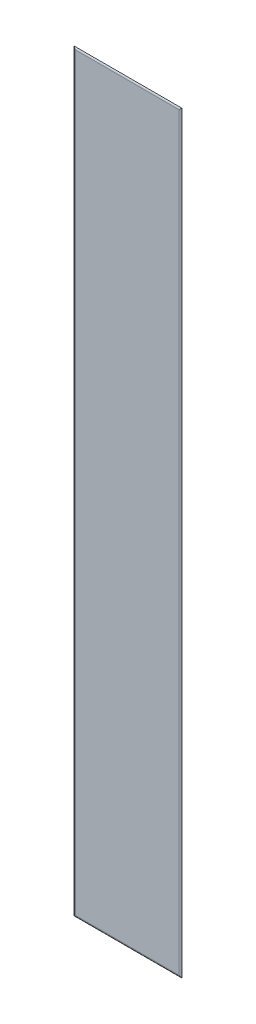
ISO-10303-21;
HEADER;
FILE_DESCRIPTION(('STEP AP214'),'2;1');
FILE_NAME('part.step','',(''),(''),'','','');
FILE_SCHEMA(('AUTOMOTIVE_DESIGN { 1 0 10303 214 1 1 1 1 }'));
ENDSEC;
DATA;
#1=APPLICATION_CONTEXT('core data for automotive mechanical design processes');
#2=APPLICATION_PROTOCOL_DEFINITION('international standard','automotive_design',2000,#1);
#3=PRODUCT_CONTEXT('',#1,'mechanical');
#4=PRODUCT('Part','Part','',(#3));
#5=PRODUCT_RELATED_PRODUCT_CATEGORY('part','',(#4));
#6=PRODUCT_DEFINITION_FORMATION('','',#4);
#7=PRODUCT_DEFINITION_CONTEXT('part definition',#1,'design');
#8=PRODUCT_DEFINITION('design','',#6,#7);
#9=PRODUCT_DEFINITION_SHAPE('','',#8);
#10=(LENGTH_UNIT() NAMED_UNIT(*) SI_UNIT(.MILLI.,.METRE.));
#11=(NAMED_UNIT(*) PLANE_ANGLE_UNIT() SI_UNIT($,.RADIAN.));
#12=(NAMED_UNIT(*) SI_UNIT($,.STERADIAN.) SOLID_ANGLE_UNIT());
#13=UNCERTAINTY_MEASURE_WITH_UNIT(LENGTH_MEASURE(1.E-05),#10,'distance_accuracy_value','');
#14=(GEOMETRIC_REPRESENTATION_CONTEXT(3) GLOBAL_UNCERTAINTY_ASSIGNED_CONTEXT((#13)) GLOBAL_UNIT_ASSIGNED_CONTEXT((#10,
#11,#12)) REPRESENTATION_CONTEXT('',''));
#15=CARTESIAN_POINT('',(0.,0.,0.));
#16=DIRECTION('',(0.,0.,1.));
#17=DIRECTION('',(1.,0.,0.));
#18=AXIS2_PLACEMENT_3D('',#15,#16,#17);
#19=CARTESIAN_POINT('',(-7.453921944202,4.992858571571,-0.007));
#20=DIRECTION('',(1.,0.,0.));
#21=DIRECTION('',(0.,0.71414284285414,0.700000000000148));
#22=AXIS2_PLACEMENT_3D('',#19,#20,#21);
#23=CYLINDRICAL_SURFACE('',#22,0.01);
#24=DIRECTION('',(1.,0.,0.));
#25=VECTOR('',#24,1.);
#26=CARTESIAN_POINT('',(-7.453921944202,4.992858571571,0.003));
#27=LINE('',#26,#25);
#28=CARTESIAN_POINT('',(-7.846780515773,4.992858571571,0.003));
#29=VERTEX_POINT('',#28);
#30=CARTESIAN_POINT('',(-7.46106337263,4.992858571571,0.003));
#31=VERTEX_POINT('',#30);
#32=EDGE_CURVE('E107',#29,#31,#27,.T.);
#33=ORIENTED_EDGE('',*,*,#32,.T.);
#34=CARTESIAN_POINT('',(-7.46106337263,4.992858571571,0.003));
#35=CARTESIAN_POINT('',(-7.45833966839473,4.99558227580627,0.00300000000000001));
#36=CARTESIAN_POINT('',(-7.45582853716617,4.99809340703483,0.00194511388568464));
#37=CARTESIAN_POINT('',(-7.453921944202,5.,0.));
#38=(BOUNDED_CURVE() B_SPLINE_CURVE(3,(#34,#35,#36,#37),.UNSPECIFIED.,.F.,
.F.) B_SPLINE_CURVE_WITH_KNOTS((4,4),(1.5707963267949,2.36619515697608),
.UNSPECIFIED.) CURVE() GEOMETRIC_REPRESENTATION_ITEM() RATIONAL_B_SPLINE_CURVE((1.,
0.947969630486574,0.947969630486574,1.)) REPRESENTATION_ITEM(''));
#39=CARTESIAN_POINT('',(-7.453921944202,5.,0.));
#40=VERTEX_POINT('',#39);
#41=EDGE_CURVE('E11',#31,#40,#38,.T.);
#42=ORIENTED_EDGE('',*,*,#41,.T.);
#43=DIRECTION('',(-1.,0.,0.));
#44=VECTOR('',#43,1.);
#45=CARTESIAN_POINT('',(-7.453921944202,5.,0.));
#46=LINE('',#45,#44);
#47=CARTESIAN_POINT('',(-7.853921944202,5.,0.));
#48=VERTEX_POINT('',#47);
#49=EDGE_CURVE('E95',#40,#48,#46,.T.);
#50=ORIENTED_EDGE('',*,*,#49,.T.);
#51=CARTESIAN_POINT('',(-7.846780515773,4.992858571571,0.003));
#52=CARTESIAN_POINT('',(-7.84950422000844,4.99558227580643,0.00300000000000001));
#53=CARTESIAN_POINT('',(-7.85201535123712,4.99809340703512,0.0019451138855627));
#54=CARTESIAN_POINT('',(-7.853921944202,5.,0.));
#55=(BOUNDED_CURVE() B_SPLINE_CURVE(3,(#51,#52,#53,#54),.UNSPECIFIED.,.F.,
.F.) B_SPLINE_CURVE_WITH_KNOTS((4,4),(1.5707963267949,2.36619515702201),
.UNSPECIFIED.) CURVE() GEOMETRIC_REPRESENTATION_ITEM() RATIONAL_B_SPLINE_CURVE((1.,
0.947969630480644,0.947969630480644,1.)) REPRESENTATION_ITEM(''));
#56=EDGE_CURVE('E20',#29,#48,#55,.T.);
#57=ORIENTED_EDGE('',*,*,#56,.F.);
#58=EDGE_LOOP('',(#33,#42,#50,#57));
#59=FACE_BOUND('',#58,.T.);
#60=ADVANCED_FACE('F16',(#59),#23,.T.);
#61=CARTESIAN_POINT('',(-7.46106337263,2.2,-0.007));
#62=DIRECTION('',(0.,-1.,0.));
#63=DIRECTION('',(0.71414284285414,0.,0.700000000000148));
#64=AXIS2_PLACEMENT_3D('',#61,#62,#63);
#65=CYLINDRICAL_SURFACE('',#64,0.01);
#66=DIRECTION('',(0.,-1.,0.));
#67=VECTOR('',#66,1.);
#68=CARTESIAN_POINT('',(-7.46106337263,2.2,0.003));
#69=LINE('',#68,#67);
#70=CARTESIAN_POINT('',(-7.46106337263,2.207141428429,0.003));
#71=VERTEX_POINT('',#70);
#72=EDGE_CURVE('E81',#31,#71,#69,.T.);
#73=ORIENTED_EDGE('',*,*,#72,.T.);
#74=CARTESIAN_POINT('',(-7.46106337263,2.207141428429,0.003));
#75=CARTESIAN_POINT('',(-7.45833966839473,2.20441772419373,0.00300000000000001));
#76=CARTESIAN_POINT('',(-7.45582853716617,2.20190659296517,0.00194511388568464));
#77=CARTESIAN_POINT('',(-7.453921944202,2.2,0.));
#78=(BOUNDED_CURVE() B_SPLINE_CURVE(3,(#74,#75,#76,#77),.UNSPECIFIED.,.F.,
.F.) B_SPLINE_CURVE_WITH_KNOTS((4,4),(1.5707963267949,2.36619515697608),
.UNSPECIFIED.) CURVE() GEOMETRIC_REPRESENTATION_ITEM() RATIONAL_B_SPLINE_CURVE((1.,
0.947969630486574,0.947969630486574,1.)) REPRESENTATION_ITEM(''));
#79=CARTESIAN_POINT('',(-7.453921944202,2.2,0.));
#80=VERTEX_POINT('',#79);
#81=EDGE_CURVE('E28',#71,#80,#78,.T.);
#82=ORIENTED_EDGE('',*,*,#81,.T.);
#83=DIRECTION('',(0.,1.,0.));
#84=VECTOR('',#83,1.);
#85=CARTESIAN_POINT('',(-7.453921944202,2.2,0.));
#86=LINE('',#85,#84);
#87=EDGE_CURVE('E79',#80,#40,#86,.T.);
#88=ORIENTED_EDGE('',*,*,#87,.T.);
#89=ORIENTED_EDGE('',*,*,#41,.F.);
#90=EDGE_LOOP('',(#73,#82,#88,#89));
#91=FACE_BOUND('',#90,.T.);
#92=ADVANCED_FACE('F77',(#91),#65,.T.);
#93=CARTESIAN_POINT('',(-7.853921944202,2.207141428429,-0.007));
#94=DIRECTION('',(-1.,0.,0.));
#95=DIRECTION('',(0.,-0.71414284285414,0.700000000000148));
#96=AXIS2_PLACEMENT_3D('',#93,#94,#95);
#97=CYLINDRICAL_SURFACE('',#96,0.01);
#98=DIRECTION('',(-1.,0.,0.));
#99=VECTOR('',#98,1.);
#100=CARTESIAN_POINT('',(-7.853921944202,2.207141428429,0.003));
#101=LINE('',#100,#99);
#102=CARTESIAN_POINT('',(-7.846780515773,2.207141428429,0.003));
#103=VERTEX_POINT('',#102);
#104=EDGE_CURVE('E128',#71,#103,#101,.T.);
#105=ORIENTED_EDGE('',*,*,#104,.T.);
#106=CARTESIAN_POINT('',(-7.846780515773,2.207141428429,0.003));
#107=CARTESIAN_POINT('',(-7.84950422000843,2.20441772419357,0.00300000000000005));
#108=CARTESIAN_POINT('',(-7.85201535123712,2.20190659296488,0.00194511388556276));
#109=CARTESIAN_POINT('',(-7.853921944202,2.2,0.));
#110=(BOUNDED_CURVE() B_SPLINE_CURVE(3,(#106,#107,#108,#109),.UNSPECIFIED.,.F.,
.F.) B_SPLINE_CURVE_WITH_KNOTS((4,4),(1.57079632679491,2.36619515702203),
.UNSPECIFIED.) CURVE() GEOMETRIC_REPRESENTATION_ITEM() RATIONAL_B_SPLINE_CURVE((1.,
0.947969630480644,0.947969630480644,1.)) REPRESENTATION_ITEM(''));
#111=CARTESIAN_POINT('',(-7.853921944202,2.2,0.));
#112=VERTEX_POINT('',#111);
#113=EDGE_CURVE('E52',#103,#112,#110,.T.);
#114=ORIENTED_EDGE('',*,*,#113,.T.);
#115=DIRECTION('',(1.,0.,0.));
#116=VECTOR('',#115,1.);
#117=CARTESIAN_POINT('',(-7.853921944202,2.2,0.));
#118=LINE('',#117,#116);
#119=EDGE_CURVE('E86',#112,#80,#118,.T.);
#120=ORIENTED_EDGE('',*,*,#119,.T.);
#121=ORIENTED_EDGE('',*,*,#81,.F.);
#122=EDGE_LOOP('',(#105,#114,#120,#121));
#123=FACE_BOUND('',#122,.T.);
#124=ADVANCED_FACE('F18',(#123),#97,.T.);
#125=CARTESIAN_POINT('',(-7.846780515773,5.,-0.007));
#126=DIRECTION('',(0.,1.,0.));
#127=DIRECTION('',(-0.71414284285414,0.,0.700000000000148));
#128=AXIS2_PLACEMENT_3D('',#125,#126,#127);
#129=CYLINDRICAL_SURFACE('',#128,0.01);
#130=DIRECTION('',(0.,-1.,0.));
#131=VECTOR('',#130,1.);
#132=CARTESIAN_POINT('',(-7.853921944202,5.,0.));
#133=LINE('',#132,#131);
#134=EDGE_CURVE('E90',#48,#112,#133,.T.);
#135=ORIENTED_EDGE('',*,*,#134,.T.);
#136=ORIENTED_EDGE('',*,*,#113,.F.);
#137=DIRECTION('',(0.,1.,0.));
#138=VECTOR('',#137,1.);
#139=CARTESIAN_POINT('',(-7.846780515773,5.,0.003));
#140=LINE('',#139,#138);
#141=EDGE_CURVE('E113',#103,#29,#140,.T.);
#142=ORIENTED_EDGE('',*,*,#141,.T.);
#143=ORIENTED_EDGE('',*,*,#56,.T.);
#144=EDGE_LOOP('',(#135,#136,#142,#143));
#145=FACE_BOUND('',#144,.T.);
#146=ADVANCED_FACE('F141',(#145),#129,.T.);
#147=CARTESIAN_POINT('',(-7.653921944202,2.9,0.003));
#148=DIRECTION('',(0.,0.,1.));
#149=DIRECTION('',(1.,0.,0.));
#150=AXIS2_PLACEMENT_3D('',#147,#148,#149);
#151=PLANE('',#150);
#152=ORIENTED_EDGE('',*,*,#32,.F.);
#153=ORIENTED_EDGE('',*,*,#141,.F.);
#154=ORIENTED_EDGE('',*,*,#104,.F.);
#155=ORIENTED_EDGE('',*,*,#72,.F.);
#156=EDGE_LOOP('',(#152,#153,#154,#155));
#157=FACE_BOUND('',#156,.T.);
#158=ADVANCED_FACE('F143',(#157),#151,.T.);
#159=CARTESIAN_POINT('',(-7.653921944202,2.9,0.));
#160=DIRECTION('',(0.,0.,1.));
#161=DIRECTION('',(1.,0.,0.));
#162=AXIS2_PLACEMENT_3D('',#159,#160,#161);
#163=PLANE('',#162);
#164=ORIENTED_EDGE('',*,*,#87,.F.);
#165=ORIENTED_EDGE('',*,*,#119,.F.);
#166=ORIENTED_EDGE('',*,*,#134,.F.);
#167=ORIENTED_EDGE('',*,*,#49,.F.);
#168=EDGE_LOOP('',(#164,#165,#166,#167));
#169=FACE_BOUND('',#168,.T.);
#170=ADVANCED_FACE('F93',(#169),#163,.F.);
#171=CLOSED_SHELL('',(#60,#92,#124,#146,#158,#170));
#172=MANIFOLD_SOLID_BREP('B1',#171);
#173=ADVANCED_BREP_SHAPE_REPRESENTATION('',(#18,#172),#14);
#174=SHAPE_DEFINITION_REPRESENTATION(#9,#173);
ENDSEC;
END-ISO-10303-21;
